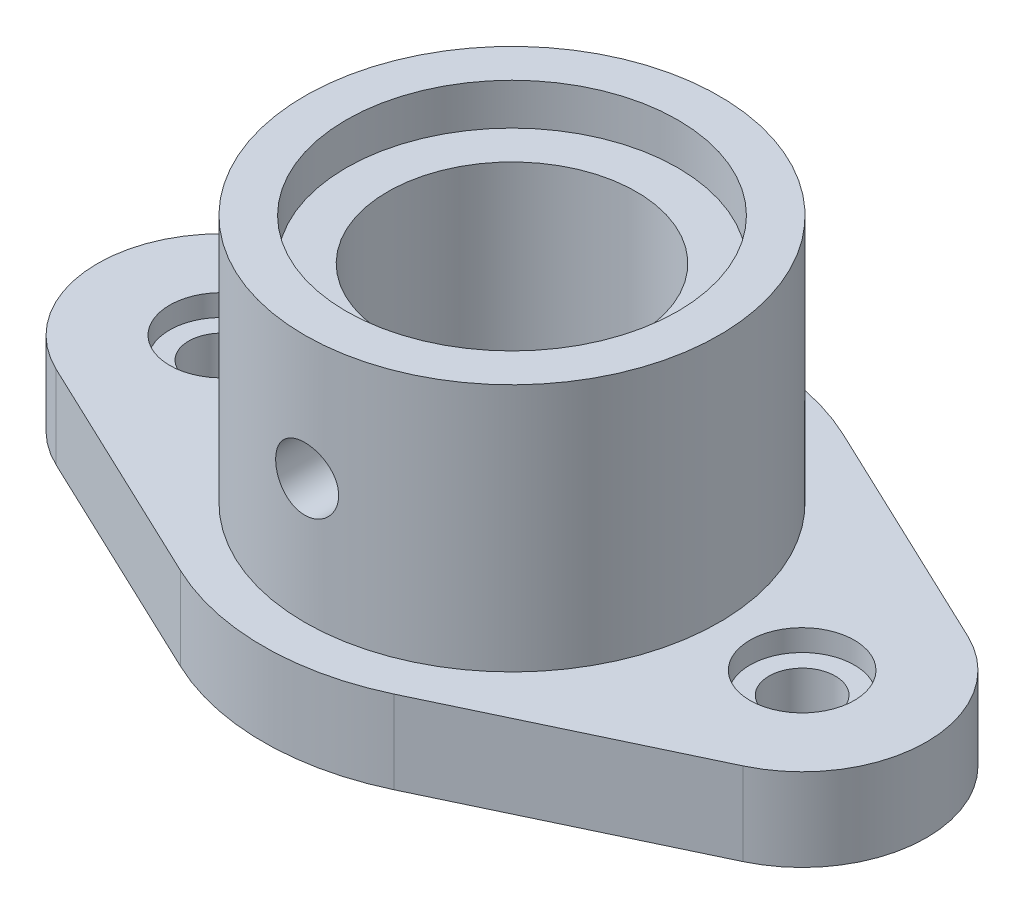
ISO-10303-21;
HEADER;
FILE_DESCRIPTION(('STEP AP214'),'2;1');
FILE_NAME('part.step','',(''),(''),'','','');
FILE_SCHEMA(('AUTOMOTIVE_DESIGN { 1 0 10303 214 1 1 1 1 }'));
ENDSEC;
DATA;
#1=APPLICATION_CONTEXT('core data for automotive mechanical design processes');
#2=APPLICATION_PROTOCOL_DEFINITION('international standard','automotive_design',2000,#1);
#3=PRODUCT_CONTEXT('',#1,'mechanical');
#4=PRODUCT('Part','Part','',(#3));
#5=PRODUCT_RELATED_PRODUCT_CATEGORY('part','',(#4));
#6=PRODUCT_DEFINITION_FORMATION('','',#4);
#7=PRODUCT_DEFINITION_CONTEXT('part definition',#1,'design');
#8=PRODUCT_DEFINITION('design','',#6,#7);
#9=PRODUCT_DEFINITION_SHAPE('','',#8);
#10=(LENGTH_UNIT() NAMED_UNIT(*) SI_UNIT(.MILLI.,.METRE.));
#11=(NAMED_UNIT(*) PLANE_ANGLE_UNIT() SI_UNIT($,.RADIAN.));
#12=(NAMED_UNIT(*) SI_UNIT($,.STERADIAN.) SOLID_ANGLE_UNIT());
#13=UNCERTAINTY_MEASURE_WITH_UNIT(LENGTH_MEASURE(1.E-05),#10,'distance_accuracy_value','');
#14=(GEOMETRIC_REPRESENTATION_CONTEXT(3) GLOBAL_UNCERTAINTY_ASSIGNED_CONTEXT((#13)) GLOBAL_UNIT_ASSIGNED_CONTEXT((#10,
#11,#12)) REPRESENTATION_CONTEXT('',''));
#15=CARTESIAN_POINT('',(0.,0.,0.));
#16=DIRECTION('',(0.,0.,1.));
#17=DIRECTION('',(1.,0.,0.));
#18=AXIS2_PLACEMENT_3D('',#15,#16,#17);
#19=CARTESIAN_POINT('',(-44.45,12.7,0.));
#20=DIRECTION('',(0.,-1.,0.));
#21=DIRECTION('',(0.,0.,-1.));
#22=AXIS2_PLACEMENT_3D('',#19,#20,#21);
#23=CYLINDRICAL_SURFACE('',#22,19.05);
#24=CARTESIAN_POINT('',(-44.45,0.,0.));
#25=DIRECTION('',(0.,1.,0.));
#26=DIRECTION('',(0.,0.,1.));
#27=AXIS2_PLACEMENT_3D('',#24,#25,#26);
#28=CIRCLE('',#27,19.05);
#29=CARTESIAN_POINT('',(-52.6142857142857,0.,-17.211825550345));
#30=VERTEX_POINT('',#29);
#31=CARTESIAN_POINT('',(-52.6142857142857,0.,17.211825550345));
#32=VERTEX_POINT('',#31);
#33=EDGE_CURVE('E139',#30,#32,#28,.T.);
#34=ORIENTED_EDGE('',*,*,#33,.T.);
#35=DIRECTION('',(0.,-1.,0.));
#36=VECTOR('',#35,1.);
#37=CARTESIAN_POINT('',(-52.6142857142857,12.7,17.211825550345));
#38=LINE('',#37,#36);
#39=CARTESIAN_POINT('',(-52.6142857142857,12.7,17.211825550345));
#40=VERTEX_POINT('',#39);
#41=EDGE_CURVE('E49',#40,#32,#38,.T.);
#42=ORIENTED_EDGE('',*,*,#41,.F.);
#43=CARTESIAN_POINT('',(-44.45,12.7,0.));
#44=DIRECTION('',(0.,1.,0.));
#45=DIRECTION('',(0.,0.,1.));
#46=AXIS2_PLACEMENT_3D('',#43,#44,#45);
#47=CIRCLE('',#46,19.05);
#48=CARTESIAN_POINT('',(-52.6142857142857,12.7,-17.211825550345));
#49=VERTEX_POINT('',#48);
#50=EDGE_CURVE('E154',#49,#40,#47,.T.);
#51=ORIENTED_EDGE('',*,*,#50,.F.);
#52=DIRECTION('',(0.,-1.,0.));
#53=VECTOR('',#52,1.);
#54=CARTESIAN_POINT('',(-52.6142857142857,12.7,-17.211825550345));
#55=LINE('',#54,#53);
#56=EDGE_CURVE('E135',#49,#30,#55,.T.);
#57=ORIENTED_EDGE('',*,*,#56,.T.);
#58=EDGE_LOOP('',(#34,#42,#51,#57));
#59=FACE_BOUND('',#58,.T.);
#60=ADVANCED_FACE('F35',(#59),#23,.T.);
#61=CARTESIAN_POINT('',(-16.3285714285714,12.7,34.4236511006901));
#62=DIRECTION('',(0.428571428571429,0.,-0.903507902905251));
#63=DIRECTION('',(-0.903507902905251,0.,-0.428571428571429));
#64=AXIS2_PLACEMENT_3D('',#61,#62,#63);
#65=PLANE('',#64);
#66=DIRECTION('',(0.903507902905251,0.,0.428571428571429));
#67=VECTOR('',#66,1.);
#68=CARTESIAN_POINT('',(-16.3285714285714,0.,34.4236511006901));
#69=LINE('',#68,#67);
#70=CARTESIAN_POINT('',(-16.3285714285715,0.,34.4236511006901));
#71=VERTEX_POINT('',#70);
#72=EDGE_CURVE('E142',#32,#71,#69,.T.);
#73=ORIENTED_EDGE('',*,*,#72,.T.);
#74=DIRECTION('',(0.,-1.,0.));
#75=VECTOR('',#74,1.);
#76=CARTESIAN_POINT('',(-16.3285714285715,12.7,34.4236511006901));
#77=LINE('',#76,#75);
#78=CARTESIAN_POINT('',(-16.3285714285715,12.7,34.4236511006901));
#79=VERTEX_POINT('',#78);
#80=EDGE_CURVE('E164',#79,#71,#77,.T.);
#81=ORIENTED_EDGE('',*,*,#80,.F.);
#82=DIRECTION('',(0.903507902905251,0.,0.428571428571429));
#83=VECTOR('',#82,1.);
#84=CARTESIAN_POINT('',(-16.3285714285714,12.7,34.4236511006901));
#85=LINE('',#84,#83);
#86=EDGE_CURVE('E102',#40,#79,#85,.T.);
#87=ORIENTED_EDGE('',*,*,#86,.F.);
#88=ORIENTED_EDGE('',*,*,#41,.T.);
#89=EDGE_LOOP('',(#73,#81,#87,#88));
#90=FACE_BOUND('',#89,.T.);
#91=ADVANCED_FACE('F167',(#90),#65,.F.);
#92=CARTESIAN_POINT('',(0.,12.7,0.));
#93=DIRECTION('',(0.,-1.,0.));
#94=DIRECTION('',(0.,0.,-1.));
#95=AXIS2_PLACEMENT_3D('',#92,#93,#94);
#96=CYLINDRICAL_SURFACE('',#95,38.1);
#97=CARTESIAN_POINT('',(0.,0.,0.));
#98=DIRECTION('',(0.,1.,0.));
#99=DIRECTION('',(0.,0.,1.));
#100=AXIS2_PLACEMENT_3D('',#97,#98,#99);
#101=CIRCLE('',#100,38.1);
#102=CARTESIAN_POINT('',(16.3285714285714,0.,34.4236511006901));
#103=VERTEX_POINT('',#102);
#104=EDGE_CURVE('E145',#71,#103,#101,.T.);
#105=ORIENTED_EDGE('',*,*,#104,.T.);
#106=DIRECTION('',(0.,-1.,0.));
#107=VECTOR('',#106,1.);
#108=CARTESIAN_POINT('',(16.3285714285714,12.7,34.4236511006901));
#109=LINE('',#108,#107);
#110=CARTESIAN_POINT('',(16.3285714285714,12.7,34.4236511006901));
#111=VERTEX_POINT('',#110);
#112=EDGE_CURVE('E161',#111,#103,#109,.T.);
#113=ORIENTED_EDGE('',*,*,#112,.F.);
#114=CARTESIAN_POINT('',(0.,12.7,0.));
#115=DIRECTION('',(0.,1.,0.));
#116=DIRECTION('',(0.,0.,1.));
#117=AXIS2_PLACEMENT_3D('',#114,#115,#116);
#118=CIRCLE('',#117,38.1);
#119=EDGE_CURVE('E185',#79,#111,#118,.T.);
#120=ORIENTED_EDGE('',*,*,#119,.F.);
#121=ORIENTED_EDGE('',*,*,#80,.T.);
#122=EDGE_LOOP('',(#105,#113,#120,#121));
#123=FACE_BOUND('',#122,.T.);
#124=ADVANCED_FACE('F178',(#123),#96,.T.);
#125=CARTESIAN_POINT('',(16.3285714285714,12.7,34.4236511006901));
#126=DIRECTION('',(-0.428571428571429,0.,-0.903507902905251));
#127=DIRECTION('',(-0.903507902905251,0.,0.428571428571429));
#128=AXIS2_PLACEMENT_3D('',#125,#126,#127);
#129=PLANE('',#128);
#130=DIRECTION('',(0.903507902905251,0.,-0.428571428571429));
#131=VECTOR('',#130,1.);
#132=CARTESIAN_POINT('',(16.3285714285714,0.,34.4236511006901));
#133=LINE('',#132,#131);
#134=CARTESIAN_POINT('',(52.6142857142857,0.,17.211825550345));
#135=VERTEX_POINT('',#134);
#136=EDGE_CURVE('E147',#103,#135,#133,.T.);
#137=ORIENTED_EDGE('',*,*,#136,.T.);
#138=DIRECTION('',(0.,-1.,0.));
#139=VECTOR('',#138,1.);
#140=CARTESIAN_POINT('',(52.6142857142857,12.7,17.211825550345));
#141=LINE('',#140,#139);
#142=CARTESIAN_POINT('',(52.6142857142857,12.7,17.211825550345));
#143=VERTEX_POINT('',#142);
#144=EDGE_CURVE('E158',#143,#135,#141,.T.);
#145=ORIENTED_EDGE('',*,*,#144,.F.);
#146=DIRECTION('',(0.903507902905251,0.,-0.428571428571429));
#147=VECTOR('',#146,1.);
#148=CARTESIAN_POINT('',(16.3285714285714,12.7,34.4236511006901));
#149=LINE('',#148,#147);
#150=EDGE_CURVE('E184',#111,#143,#149,.T.);
#151=ORIENTED_EDGE('',*,*,#150,.F.);
#152=ORIENTED_EDGE('',*,*,#112,.T.);
#153=EDGE_LOOP('',(#137,#145,#151,#152));
#154=FACE_BOUND('',#153,.T.);
#155=ADVANCED_FACE('F182',(#154),#129,.F.);
#156=CARTESIAN_POINT('',(44.45,12.7,0.));
#157=DIRECTION('',(0.,-1.,0.));
#158=DIRECTION('',(0.,0.,-1.));
#159=AXIS2_PLACEMENT_3D('',#156,#157,#158);
#160=CYLINDRICAL_SURFACE('',#159,19.05);
#161=CARTESIAN_POINT('',(44.45,0.,0.));
#162=DIRECTION('',(0.,1.,0.));
#163=DIRECTION('',(0.,0.,1.));
#164=AXIS2_PLACEMENT_3D('',#161,#162,#163);
#165=CIRCLE('',#164,19.05);
#166=CARTESIAN_POINT('',(52.6142857142857,0.,-17.211825550345));
#167=VERTEX_POINT('',#166);
#168=EDGE_CURVE('E149',#135,#167,#165,.T.);
#169=ORIENTED_EDGE('',*,*,#168,.T.);
#170=DIRECTION('',(0.,-1.,0.));
#171=VECTOR('',#170,1.);
#172=CARTESIAN_POINT('',(52.6142857142857,12.7,-17.211825550345));
#173=LINE('',#172,#171);
#174=CARTESIAN_POINT('',(52.6142857142857,12.7,-17.211825550345));
#175=VERTEX_POINT('',#174);
#176=EDGE_CURVE('E130',#175,#167,#173,.T.);
#177=ORIENTED_EDGE('',*,*,#176,.F.);
#178=CARTESIAN_POINT('',(44.45,12.7,0.));
#179=DIRECTION('',(0.,1.,0.));
#180=DIRECTION('',(0.,0.,1.));
#181=AXIS2_PLACEMENT_3D('',#178,#179,#180);
#182=CIRCLE('',#181,19.05);
#183=EDGE_CURVE('E121',#143,#175,#182,.T.);
#184=ORIENTED_EDGE('',*,*,#183,.F.);
#185=ORIENTED_EDGE('',*,*,#144,.T.);
#186=EDGE_LOOP('',(#169,#177,#184,#185));
#187=FACE_BOUND('',#186,.T.);
#188=ADVANCED_FACE('F293',(#187),#160,.T.);
#189=CARTESIAN_POINT('',(52.6142857142857,12.7,-17.211825550345));
#190=DIRECTION('',(-0.428571428571428,0.,0.903507902905251));
#191=DIRECTION('',(0.903507902905251,0.,0.428571428571429));
#192=AXIS2_PLACEMENT_3D('',#189,#190,#191);
#193=PLANE('',#192);
#194=DIRECTION('',(-0.903507902905251,0.,-0.428571428571428));
#195=VECTOR('',#194,1.);
#196=CARTESIAN_POINT('',(52.6142857142857,0.,-17.211825550345));
#197=LINE('',#196,#195);
#198=CARTESIAN_POINT('',(16.3285714285714,0.,-34.4236511006901));
#199=VERTEX_POINT('',#198);
#200=EDGE_CURVE('E129',#167,#199,#197,.T.);
#201=ORIENTED_EDGE('',*,*,#200,.T.);
#202=DIRECTION('',(0.,-1.,0.));
#203=VECTOR('',#202,1.);
#204=CARTESIAN_POINT('',(16.3285714285714,12.7,-34.4236511006901));
#205=LINE('',#204,#203);
#206=CARTESIAN_POINT('',(16.3285714285714,12.7,-34.4236511006901));
#207=VERTEX_POINT('',#206);
#208=EDGE_CURVE('E126',#207,#199,#205,.T.);
#209=ORIENTED_EDGE('',*,*,#208,.F.);
#210=DIRECTION('',(-0.903507902905251,0.,-0.428571428571428));
#211=VECTOR('',#210,1.);
#212=CARTESIAN_POINT('',(52.6142857142857,12.7,-17.211825550345));
#213=LINE('',#212,#211);
#214=EDGE_CURVE('E115',#175,#207,#213,.T.);
#215=ORIENTED_EDGE('',*,*,#214,.F.);
#216=ORIENTED_EDGE('',*,*,#176,.T.);
#217=EDGE_LOOP('',(#201,#209,#215,#216));
#218=FACE_BOUND('',#217,.T.);
#219=ADVANCED_FACE('F127',(#218),#193,.F.);
#220=CARTESIAN_POINT('',(0.,12.7,0.));
#221=DIRECTION('',(0.,-1.,0.));
#222=DIRECTION('',(0.,0.,-1.));
#223=AXIS2_PLACEMENT_3D('',#220,#221,#222);
#224=CYLINDRICAL_SURFACE('',#223,38.1);
#225=CARTESIAN_POINT('',(0.,0.,0.));
#226=DIRECTION('',(0.,1.,0.));
#227=DIRECTION('',(0.,0.,1.));
#228=AXIS2_PLACEMENT_3D('',#225,#226,#227);
#229=CIRCLE('',#228,38.1);
#230=CARTESIAN_POINT('',(-16.3285714285714,0.,-34.4236511006901));
#231=VERTEX_POINT('',#230);
#232=EDGE_CURVE('E87',#199,#231,#229,.T.);
#233=ORIENTED_EDGE('',*,*,#232,.T.);
#234=DIRECTION('',(0.,-1.,0.));
#235=VECTOR('',#234,1.);
#236=CARTESIAN_POINT('',(-16.3285714285714,12.7,-34.4236511006901));
#237=LINE('',#236,#235);
#238=CARTESIAN_POINT('',(-16.3285714285714,12.7,-34.4236511006901));
#239=VERTEX_POINT('',#238);
#240=EDGE_CURVE('E131',#239,#231,#237,.T.);
#241=ORIENTED_EDGE('',*,*,#240,.F.);
#242=CARTESIAN_POINT('',(0.,12.7,0.));
#243=DIRECTION('',(0.,1.,0.));
#244=DIRECTION('',(0.,0.,1.));
#245=AXIS2_PLACEMENT_3D('',#242,#243,#244);
#246=CIRCLE('',#245,38.1);
#247=EDGE_CURVE('E119',#207,#239,#246,.T.);
#248=ORIENTED_EDGE('',*,*,#247,.F.);
#249=ORIENTED_EDGE('',*,*,#208,.T.);
#250=EDGE_LOOP('',(#233,#241,#248,#249));
#251=FACE_BOUND('',#250,.T.);
#252=ADVANCED_FACE('F133',(#251),#224,.T.);
#253=CARTESIAN_POINT('',(-52.6142857142857,12.7,-17.211825550345));
#254=DIRECTION('',(0.428571428571429,0.,0.903507902905251));
#255=DIRECTION('',(0.903507902905251,0.,-0.428571428571429));
#256=AXIS2_PLACEMENT_3D('',#253,#254,#255);
#257=PLANE('',#256);
#258=DIRECTION('',(-0.903507902905251,0.,0.428571428571429));
#259=VECTOR('',#258,1.);
#260=CARTESIAN_POINT('',(-52.6142857142857,0.,-17.211825550345));
#261=LINE('',#260,#259);
#262=EDGE_CURVE('E93',#231,#30,#261,.T.);
#263=ORIENTED_EDGE('',*,*,#262,.T.);
#264=ORIENTED_EDGE('',*,*,#56,.F.);
#265=DIRECTION('',(-0.903507902905251,0.,0.428571428571429));
#266=VECTOR('',#265,1.);
#267=CARTESIAN_POINT('',(-52.6142857142857,12.7,-17.211825550345));
#268=LINE('',#267,#266);
#269=EDGE_CURVE('E58',#239,#49,#268,.T.);
#270=ORIENTED_EDGE('',*,*,#269,.F.);
#271=ORIENTED_EDGE('',*,*,#240,.T.);
#272=EDGE_LOOP('',(#263,#264,#270,#271));
#273=FACE_BOUND('',#272,.T.);
#274=ADVANCED_FACE('F301',(#273),#257,.F.);
#275=CARTESIAN_POINT('',(-44.45,12.7,0.));
#276=DIRECTION('',(0.,1.,0.));
#277=DIRECTION('',(0.,0.,1.));
#278=AXIS2_PLACEMENT_3D('',#275,#276,#277);
#279=PLANE('',#278);
#280=CARTESIAN_POINT('',(-44.45,12.7,0.));
#281=DIRECTION('',(0.,1.,0.));
#282=DIRECTION('',(0.,0.,1.));
#283=AXIS2_PLACEMENT_3D('',#280,#281,#282);
#284=CIRCLE('',#283,8.001);
#285=CARTESIAN_POINT('',(-44.45,12.7,8.001));
#286=VERTEX_POINT('',#285);
#287=EDGE_CURVE('E226',#286,#286,#284,.T.);
#288=ORIENTED_EDGE('',*,*,#287,.F.);
#289=EDGE_LOOP('',(#288));
#290=FACE_BOUND('',#289,.T.);
#291=CARTESIAN_POINT('',(44.45,12.7,0.));
#292=DIRECTION('',(0.,1.,0.));
#293=DIRECTION('',(0.,0.,1.));
#294=AXIS2_PLACEMENT_3D('',#291,#292,#293);
#295=CIRCLE('',#294,8.001);
#296=CARTESIAN_POINT('',(44.45,12.7,8.001));
#297=VERTEX_POINT('',#296);
#298=EDGE_CURVE('E214',#297,#297,#295,.T.);
#299=ORIENTED_EDGE('',*,*,#298,.F.);
#300=EDGE_LOOP('',(#299));
#301=FACE_BOUND('',#300,.T.);
#302=CARTESIAN_POINT('',(0.,12.7,0.));
#303=DIRECTION('',(0.,1.,0.));
#304=DIRECTION('',(0.,0.,1.));
#305=AXIS2_PLACEMENT_3D('',#302,#303,#304);
#306=CIRCLE('',#305,31.75);
#307=CARTESIAN_POINT('',(0.,12.7,31.75));
#308=VERTEX_POINT('',#307);
#309=EDGE_CURVE('E11',#308,#308,#306,.T.);
#310=ORIENTED_EDGE('',*,*,#309,.F.);
#311=EDGE_LOOP('',(#310));
#312=FACE_BOUND('',#311,.T.);
#313=ORIENTED_EDGE('',*,*,#50,.T.);
#314=ORIENTED_EDGE('',*,*,#86,.T.);
#315=ORIENTED_EDGE('',*,*,#119,.T.);
#316=ORIENTED_EDGE('',*,*,#150,.T.);
#317=ORIENTED_EDGE('',*,*,#183,.T.);
#318=ORIENTED_EDGE('',*,*,#214,.T.);
#319=ORIENTED_EDGE('',*,*,#247,.T.);
#320=ORIENTED_EDGE('',*,*,#269,.T.);
#321=EDGE_LOOP('',(#313,#314,#315,#316,#317,#318,#319,#320));
#322=FACE_BOUND('',#321,.T.);
#323=ADVANCED_FACE('F117',(#290,#301,#312,#322),#279,.T.);
#324=CARTESIAN_POINT('',(-44.45,0.,0.));
#325=DIRECTION('',(0.,1.,0.));
#326=DIRECTION('',(0.,0.,1.));
#327=AXIS2_PLACEMENT_3D('',#324,#325,#326);
#328=PLANE('',#327);
#329=CARTESIAN_POINT('',(-44.45,0.,0.));
#330=DIRECTION('',(0.,1.,0.));
#331=DIRECTION('',(0.,0.,1.));
#332=AXIS2_PLACEMENT_3D('',#329,#330,#331);
#333=CIRCLE('',#332,5.07999999999999);
#334=CARTESIAN_POINT('',(-44.45,0.,5.07999999999999));
#335=VERTEX_POINT('',#334);
#336=EDGE_CURVE('E217',#335,#335,#333,.T.);
#337=ORIENTED_EDGE('',*,*,#336,.T.);
#338=EDGE_LOOP('',(#337));
#339=FACE_BOUND('',#338,.T.);
#340=CARTESIAN_POINT('',(44.45,0.,0.));
#341=DIRECTION('',(0.,1.,0.));
#342=DIRECTION('',(0.,0.,1.));
#343=AXIS2_PLACEMENT_3D('',#340,#341,#342);
#344=CIRCLE('',#343,5.07999999999999);
#345=CARTESIAN_POINT('',(44.45,0.,5.07999999999999));
#346=VERTEX_POINT('',#345);
#347=EDGE_CURVE('E205',#346,#346,#344,.T.);
#348=ORIENTED_EDGE('',*,*,#347,.T.);
#349=EDGE_LOOP('',(#348));
#350=FACE_BOUND('',#349,.T.);
#351=CARTESIAN_POINT('',(0.,0.,0.));
#352=DIRECTION('',(0.,1.,0.));
#353=DIRECTION('',(0.,0.,1.));
#354=AXIS2_PLACEMENT_3D('',#351,#352,#353);
#355=CIRCLE('',#354,19.05);
#356=CARTESIAN_POINT('',(0.,0.,19.05));
#357=VERTEX_POINT('',#356);
#358=EDGE_CURVE('E193',#357,#357,#355,.T.);
#359=ORIENTED_EDGE('',*,*,#358,.T.);
#360=EDGE_LOOP('',(#359));
#361=FACE_BOUND('',#360,.T.);
#362=ORIENTED_EDGE('',*,*,#33,.F.);
#363=ORIENTED_EDGE('',*,*,#262,.F.);
#364=ORIENTED_EDGE('',*,*,#232,.F.);
#365=ORIENTED_EDGE('',*,*,#200,.F.);
#366=ORIENTED_EDGE('',*,*,#168,.F.);
#367=ORIENTED_EDGE('',*,*,#136,.F.);
#368=ORIENTED_EDGE('',*,*,#104,.F.);
#369=ORIENTED_EDGE('',*,*,#72,.F.);
#370=EDGE_LOOP('',(#362,#363,#364,#365,#366,#367,#368,#369));
#371=FACE_BOUND('',#370,.T.);
#372=ADVANCED_FACE('F172',(#339,#350,#361,#371),#328,.F.);
#373=CARTESIAN_POINT('',(0.,50.8,0.));
#374=DIRECTION('',(0.,-1.,0.));
#375=DIRECTION('',(0.,0.,-1.));
#376=AXIS2_PLACEMENT_3D('',#373,#374,#375);
#377=CYLINDRICAL_SURFACE('',#376,31.75);
#378=CARTESIAN_POINT('',(-4.826,31.75,31.3810806697284));
#379=CARTESIAN_POINT('',(-4.8260018661553,31.8847419436261,31.3810798905383));
#380=CARTESIAN_POINT('',(-4.8203551463665,32.019457866581,31.3819502019671));
#381=CARTESIAN_POINT('',(-4.79781348406068,32.2879677918923,31.3854046268156));
#382=CARTESIAN_POINT('',(-4.78091597357927,32.4217615767274,31.387989131495));
#383=CARTESIAN_POINT('',(-4.73598200103108,32.6875106044496,31.3948003329495));
#384=CARTESIAN_POINT('',(-4.70793811610386,32.8194645613793,31.3990281240196));
#385=CARTESIAN_POINT('',(-4.64091192990172,33.0805576924962,31.4090048241569));
#386=CARTESIAN_POINT('',(-4.60192561507136,33.2096958151031,31.4147542913128));
#387=CARTESIAN_POINT('',(-4.513360720291,33.4640494562103,31.427600494546));
#388=CARTESIAN_POINT('',(-4.46379440944599,33.5892693272869,31.4346956690191));
#389=CARTESIAN_POINT('',(-4.35438521589033,33.835117516261,31.4500378367867));
#390=CARTESIAN_POINT('',(-4.29453854641961,33.9557441221603,31.4582852542991));
#391=CARTESIAN_POINT('',(-4.16504449722869,34.1914656570763,31.4756916956856));
#392=CARTESIAN_POINT('',(-4.09540217610511,34.3065634003684,31.4848502483282));
#393=CARTESIAN_POINT('',(-3.94675691463239,34.5305501605325,31.5038287119398));
#394=CARTESIAN_POINT('',(-3.86775049935088,34.6394368501946,31.5136488678369));
#395=CARTESIAN_POINT('',(-3.70036284240657,34.8509525632057,31.5337433125968));
#396=CARTESIAN_POINT('',(-3.61191997537499,34.9535325670202,31.5440202943338));
#397=CARTESIAN_POINT('',(-3.42670024379995,35.1509302735951,31.5646781981156));
#398=CARTESIAN_POINT('',(-3.32992030694016,35.2457450894597,31.5750591572212));
#399=CARTESIAN_POINT('',(-3.12875307227639,35.4268863790535,31.5956265936238));
#400=CARTESIAN_POINT('',(-3.02436815399328,35.5132154881816,31.6058131305053));
#401=CARTESIAN_POINT('',(-2.80864658539232,35.6768458285498,31.6257133341791));
#402=CARTESIAN_POINT('',(-2.69730738591693,35.754143719153,31.6354268252223));
#403=CARTESIAN_POINT('',(-2.46794227034277,35.8994628617084,31.6541473248498));
#404=CARTESIAN_POINT('',(-2.34988805089781,35.9674399811198,31.6631508920699));
#405=CARTESIAN_POINT('',(-2.10839273647507,36.0932163281804,31.6801497202248));
#406=CARTESIAN_POINT('',(-1.98494965380316,36.1510117600285,31.6881446048022));
#407=CARTESIAN_POINT('',(-1.60792337782613,36.3083798694195,31.7102524001697));
#408=CARTESIAN_POINT('',(-1.3473779260103,36.3921021599604,31.7225108924722));
#409=CARTESIAN_POINT('',(-0.817873809305293,36.5138954819344,31.7405625255981));
#410=CARTESIAN_POINT('',(-0.54899541168763,36.5523131990801,31.7464047419101));
#411=CARTESIAN_POINT('',(-0.00851189189896186,36.5835723135611,31.7511478535652));
#412=CARTESIAN_POINT('',(0.263093073935696,36.5764163092739,31.7500491446441));
#413=CARTESIAN_POINT('',(0.798912981074846,36.5169799455177,31.7410695034661));
#414=CARTESIAN_POINT('',(1.06317038338057,36.4650720289971,31.7332445512281));
#415=CARTESIAN_POINT('',(1.57918261418568,36.3181965029528,31.7117550204234));
#416=CARTESIAN_POINT('',(1.83093711371027,36.2232277610834,31.698090288292));
#417=CARTESIAN_POINT('',(2.31591889381348,35.9925447448171,31.6663602076528));
#418=CARTESIAN_POINT('',(2.54907063698646,35.8566740774798,31.6482780194532));
#419=CARTESIAN_POINT('',(2.9894058499768,35.548158761024,31.6097276259839));
#420=CARTESIAN_POINT('',(3.19658756375225,35.3755116272822,31.5892592595458));
#421=CARTESIAN_POINT('',(3.58129712877752,34.9962705541476,31.5479744814369));
#422=CARTESIAN_POINT('',(3.75850442208646,34.7893514363737,31.5271566423314));
#423=CARTESIAN_POINT('',(4.07573075211893,34.3485438477946,31.48772064305));
#424=CARTESIAN_POINT('',(4.21574954802041,34.1146552023566,31.469102497119));
#425=CARTESIAN_POINT('',(4.45466981730756,33.6262093400217,31.436174134966));
#426=CARTESIAN_POINT('',(4.55353769317424,33.3716354365884,31.4218674414329));
#427=CARTESIAN_POINT('',(4.70702368720634,32.8492296688503,31.3992436841821));
#428=CARTESIAN_POINT('',(4.76164501202292,32.5813987668044,31.3909261864183));
#429=CARTESIAN_POINT('',(4.82464642118158,32.0429356307147,31.3813050655429));
#430=CARTESIAN_POINT('',(4.83348120947046,31.7723577878793,31.3799324761251));
#431=CARTESIAN_POINT('',(4.80586588603897,31.2335859678068,31.3841734104998));
#432=CARTESIAN_POINT('',(4.76941721854759,30.9653919148181,31.3897867114908));
#433=CARTESIAN_POINT('',(4.65265553087364,30.4404135032763,31.4073035529928));
#434=CARTESIAN_POINT('',(4.57256961050916,30.1835774526937,31.4191745166455));
#435=CARTESIAN_POINT('',(4.37104315229028,29.6869742765597,31.4478421998681));
#436=CARTESIAN_POINT('',(4.24960052180733,29.4472080154733,31.4646391686852));
#437=CARTESIAN_POINT('',(3.96771794761046,28.9895138500629,31.5014284964492));
#438=CARTESIAN_POINT('',(3.80698400122447,28.7717689522135,31.5214445370665));
#439=CARTESIAN_POINT('',(3.45148858492913,28.3661810859602,31.5623455816839));
#440=CARTESIAN_POINT('',(3.25672513755304,28.1783398564824,31.583230636129));
#441=CARTESIAN_POINT('',(2.83669909054815,27.8362549790903,31.6237324538315));
#442=CARTESIAN_POINT('',(2.6111895429746,27.6823128884466,31.6433368214408));
#443=CARTESIAN_POINT('',(2.13723599519737,27.4144996859518,31.6788745655386));
#444=CARTESIAN_POINT('',(1.88879263631248,27.3006274540196,31.6948080446359));
#445=CARTESIAN_POINT('',(1.37701134262048,27.1166620968469,31.7211562329294));
#446=CARTESIAN_POINT('',(1.113733335518,27.0464049182874,31.731591599983));
#447=CARTESIAN_POINT('',(0.578796032676614,26.9511507459408,31.7458480488539));
#448=CARTESIAN_POINT('',(0.307137307275309,26.9261506791267,31.7496695797601));
#449=CARTESIAN_POINT('',(-0.0989586937131517,26.9231306202465,31.7501338887952));
#450=CARTESIAN_POINT('',(-0.233481410961587,26.9277721825772,31.7494256939288));
#451=CARTESIAN_POINT('',(-0.501637341101348,26.9482627070642,31.7463190490647));
#452=CARTESIAN_POINT('',(-0.635270868095055,26.9641074735324,31.743921231845));
#453=CARTESIAN_POINT('',(-0.90074796037911,27.0068972925301,31.7374984606737));
#454=CARTESIAN_POINT('',(-1.03259086663335,27.0338463234163,31.7334729235639));
#455=CARTESIAN_POINT('',(-1.29347036573143,27.0986276879381,31.7239099341355));
#456=CARTESIAN_POINT('',(-1.42250795527857,27.1364560859479,31.7183730285932));
#457=CARTESIAN_POINT('',(-1.67686484022541,27.2227019245705,31.7059431937717));
#458=CARTESIAN_POINT('',(-1.80218568047765,27.2711148936609,31.6990508372349));
#459=CARTESIAN_POINT('',(-2.0482542287486,27.3781666887283,31.6841023858937));
#460=CARTESIAN_POINT('',(-2.1690035650673,27.4368018312104,31.6760467104627));
#461=CARTESIAN_POINT('',(-2.40519435115754,27.5639148210006,31.6589887237599));
#462=CARTESIAN_POINT('',(-2.52063375486159,27.63239642118,31.6499860519035));
#463=CARTESIAN_POINT('',(-2.74533055520362,27.7786775755021,31.6312877965702));
#464=CARTESIAN_POINT('',(-2.85459012554852,27.8564738229022,31.6215924594827));
#465=CARTESIAN_POINT('',(-3.06728975384043,28.0216862106902,31.6016733519182));
#466=CARTESIAN_POINT('',(-3.17066092541805,28.1091905337723,31.5914452764622));
#467=CARTESIAN_POINT('',(-3.36964235433473,28.2925324209846,31.570841200589));
#468=CARTESIAN_POINT('',(-3.46525538625208,28.3883669803111,31.5604652546301));
#469=CARTESIAN_POINT('',(-3.64815773324166,28.5877953609352,31.5398465813721));
#470=CARTESIAN_POINT('',(-3.73544201124098,28.6913938109187,31.529603937885));
#471=CARTESIAN_POINT('',(-3.90098294999229,28.9055461509471,31.5095506710706));
#472=CARTESIAN_POINT('',(-3.97924293050774,29.0160974599697,31.499739889701));
#473=CARTESIAN_POINT('',(-4.1266747437838,29.2441312333703,31.4807658156349));
#474=CARTESIAN_POINT('',(-4.1957875270181,29.3616522524075,31.4716068911528));
#475=CARTESIAN_POINT('',(-4.32382758064726,29.6021309958218,31.454271397658));
#476=CARTESIAN_POINT('',(-4.38275858349775,29.7250867070932,31.4460944690002));
#477=CARTESIAN_POINT('',(-4.48999222139879,29.9755189768526,31.430962500533));
#478=CARTESIAN_POINT('',(-4.5383026137067,30.1029921562429,31.4240065696646));
#479=CARTESIAN_POINT('',(-4.62397517856044,30.3615886544482,31.411514162333));
#480=CARTESIAN_POINT('',(-4.66133979384286,30.4927111516925,31.4059773691996));
#481=CARTESIAN_POINT('',(-4.73716713551813,30.8091196129352,31.3946455901809));
#482=CARTESIAN_POINT('',(-4.77044191611085,30.9957000603525,31.3895823633182));
#483=CARTESIAN_POINT('',(-4.81485688864162,31.3715374651383,31.38280047275));
#484=CARTESIAN_POINT('',(-4.8259973795312,31.5607943863229,31.3810817638727));
#485=CARTESIAN_POINT('',(-4.826,31.75,31.3810806697284));
#486=B_SPLINE_CURVE_WITH_KNOTS('',3,(#378,#379,#380,#381,#382,#383,#384,#385,#386,#387,#388,
#389,#390,#391,#392,#393,#394,#395,#396,#397,#398,#399,#400,#401,#402,#403,#404,#405,#406,#407,
#408,#409,#410,#411,#412,#413,#414,#415,#416,#417,#418,#419,#420,#421,#422,#423,#424,#425,#426,
#427,#428,#429,#430,#431,#432,#433,#434,#435,#436,#437,#438,#439,#440,#441,#442,#443,#444,#445,
#446,#447,#448,#449,#450,#451,#452,#453,#454,#455,#456,#457,#458,#459,#460,#461,#462,#463,#464,
#465,#466,#467,#468,#469,#470,#471,#472,#473,#474,#475,#476,#477,#478,#479,#480,#481,#482,#483,
#484,#485),.UNSPECIFIED.,.T.,.F.,(4,2,2,2,2,2,2,2,2,2,2,2,2,2,2,2,2,2,2,2,2,2,2,2,2,2,2,2,2,2,2,
2,2,2,2,2,2,2,2,2,2,2,2,2,2,2,2,2,2,2,2,2,2,4),(0.,0.40406003725429,0.808212331815288,
1.21263422130655,1.61720464230762,2.02130842717708,2.42556138372486,2.82960634027324,
3.23380170655828,3.64082022829568,4.04798938848481,4.45503169226673,4.86222408699239,
5.27128240588447,5.68049290321276,6.49798198538133,7.30917391548025,8.12031959602982,
8.92477906262968,9.72925968486361,10.5368562623486,11.3445074184891,12.1603139257128,
12.9761257157365,13.7926022719503,14.6090196509009,15.4173134734916,16.2255815177627,
17.0296827485733,17.833824672545,18.6441784973957,19.4545794278744,20.2719217526441,
21.0892412282551,21.9034675160734,22.7176385146096,23.1210594529126,23.5243293868717,
23.927743927307,24.3310127151484,24.7341114674704,25.137065264837,25.5401730528313,
25.9431381576639,26.350121093185,26.7569578300934,27.1640390750879,27.570970086329,
27.9804117155229,28.3897029309217,28.7986942008234,29.2075941277025,29.7749858235183,
30.3423698559412),.UNSPECIFIED.);
#487=CARTESIAN_POINT('',(-4.826,31.75,31.3810806697284));
#488=VERTEX_POINT('',#487);
#489=EDGE_CURVE('E38',#488,#488,#486,.T.);
#490=ORIENTED_EDGE('',*,*,#489,.T.);
#491=EDGE_LOOP('',(#490));
#492=FACE_BOUND('',#491,.T.);
#493=CARTESIAN_POINT('',(0.,50.8,0.));
#494=DIRECTION('',(0.,1.,0.));
#495=DIRECTION('',(0.,0.,1.));
#496=AXIS2_PLACEMENT_3D('',#493,#494,#495);
#497=CIRCLE('',#496,31.75);
#498=CARTESIAN_POINT('',(0.,50.8,31.75));
#499=VERTEX_POINT('',#498);
#500=EDGE_CURVE('E143',#499,#499,#497,.T.);
#501=ORIENTED_EDGE('',*,*,#500,.F.);
#502=EDGE_LOOP('',(#501));
#503=FACE_BOUND('',#502,.T.);
#504=ORIENTED_EDGE('',*,*,#309,.T.);
#505=EDGE_LOOP('',(#504));
#506=FACE_BOUND('',#505,.T.);
#507=ADVANCED_FACE('F306',(#492,#503,#506),#377,.T.);
#508=CARTESIAN_POINT('',(0.,50.8,0.));
#509=DIRECTION('',(0.,1.,0.));
#510=DIRECTION('',(0.,0.,1.));
#511=AXIS2_PLACEMENT_3D('',#508,#509,#510);
#512=PLANE('',#511);
#513=CARTESIAN_POINT('',(0.,50.8,0.));
#514=DIRECTION('',(0.,1.,0.));
#515=DIRECTION('',(0.,0.,1.));
#516=AXIS2_PLACEMENT_3D('',#513,#514,#515);
#517=CIRCLE('',#516,25.4);
#518=CARTESIAN_POINT('',(0.,50.8,25.4));
#519=VERTEX_POINT('',#518);
#520=EDGE_CURVE('E202',#519,#519,#517,.T.);
#521=ORIENTED_EDGE('',*,*,#520,.F.);
#522=EDGE_LOOP('',(#521));
#523=FACE_BOUND('',#522,.T.);
#524=ORIENTED_EDGE('',*,*,#500,.T.);
#525=EDGE_LOOP('',(#524));
#526=FACE_BOUND('',#525,.T.);
#527=ADVANCED_FACE('F278',(#523,#526),#512,.T.);
#528=CARTESIAN_POINT('',(0.,50.8,0.));
#529=DIRECTION('',(0.,1.,0.));
#530=DIRECTION('',(0.,0.,1.));
#531=AXIS2_PLACEMENT_3D('',#528,#529,#530);
#532=CYLINDRICAL_SURFACE('',#531,19.05);
#533=CARTESIAN_POINT('',(0.,26.924,19.05));
#534=CARTESIAN_POINT('',(0.266523640409036,26.924007266705,19.0499955743465));
#535=CARTESIAN_POINT('',(0.533127776508243,26.946153024364,19.044351111249));
#536=CARTESIAN_POINT('',(1.05868748938051,27.0340135613825,19.0223814029259));
#537=CARTESIAN_POINT('',(1.31763877738875,27.0997523047327,19.0060502830832));
#538=CARTESIAN_POINT('',(1.82022799711811,27.2725483022071,18.9645145284427));
#539=CARTESIAN_POINT('',(2.06388416581402,27.3795552191125,18.939320707279));
#540=CARTESIAN_POINT('',(2.52978809364021,27.6316710664456,18.8827386652933));
#541=CARTESIAN_POINT('',(2.7520349901974,27.7767815311768,18.8513501950461));
#542=CARTESIAN_POINT('',(3.17350203867229,28.1042198548342,18.7850421547524));
#543=CARTESIAN_POINT('',(3.3722059958357,28.2872009026195,18.7500669399191));
#544=CARTESIAN_POINT('',(3.73645917095422,28.6837881807773,18.6808945703291));
#545=CARTESIAN_POINT('',(3.90200454663631,28.897397955359,18.6466975061477));
#546=CARTESIAN_POINT('',(4.19768639922928,29.3532090346113,18.5823907746642));
#547=CARTESIAN_POINT('',(4.32724224274738,29.595797853741,18.5523516655455));
#548=CARTESIAN_POINT('',(4.54353230146951,30.1001959690549,18.5005747921464));
#549=CARTESIAN_POINT('',(4.63027356527884,30.3620020933179,18.4788356615661));
#550=CARTESIAN_POINT('',(4.75670501962698,30.8917189650103,18.4466925422399));
#551=CARTESIAN_POINT('',(4.79732487308753,31.1593939358538,18.4360649422281));
#552=CARTESIAN_POINT('',(4.83325673322292,31.6979538000619,18.4266790944644));
#553=CARTESIAN_POINT('',(4.82857632207353,31.9688381486734,18.4279188604001));
#554=CARTESIAN_POINT('',(4.77478153005855,32.4989768902074,18.4419268266082));
#555=CARTESIAN_POINT('',(4.7267782589243,32.7583528425405,18.4544067326209));
#556=CARTESIAN_POINT('',(4.58947423715228,33.2652444770841,18.4890289436535));
#557=CARTESIAN_POINT('',(4.50017047419361,33.5127592927292,18.5111719534614));
#558=CARTESIAN_POINT('',(4.28186174459625,33.9918657413499,18.5628878465075));
#559=CARTESIAN_POINT('',(4.15245621860907,34.2232664894735,18.5925351129549));
#560=CARTESIAN_POINT('',(3.85789731173016,34.6614656606279,18.6558774212707));
#561=CARTESIAN_POINT('',(3.69273752131787,34.8682596621943,18.6895731884145));
#562=CARTESIAN_POINT('',(3.32561742891672,35.2577388848732,18.7584270035222));
#563=CARTESIAN_POINT('',(3.12272037220959,35.4395398037317,18.7935989633955));
#564=CARTESIAN_POINT('',(2.68889519307718,35.7667062682127,18.8605525278951));
#565=CARTESIAN_POINT('',(2.45796616891405,35.9120706412758,18.8923340233944));
#566=CARTESIAN_POINT('',(1.97334955444475,36.1625748779686,18.9490909123743));
#567=CARTESIAN_POINT('',(1.71958295425139,36.2675679087939,18.9740413680249));
#568=CARTESIAN_POINT('',(1.19722795564139,36.4331558741282,19.0141438237889));
#569=CARTESIAN_POINT('',(0.928642482002608,36.4937595362289,19.0292977499727));
#570=CARTESIAN_POINT('',(0.391831819254899,36.5674905390798,19.0478134612873));
#571=CARTESIAN_POINT('',(0.123782045762563,36.5818217315524,19.0514741887354));
#572=CARTESIAN_POINT('',(-0.410886775311172,36.5659072694443,19.0474440488914));
#573=CARTESIAN_POINT('',(-0.677505953081031,36.5356657426118,19.0397542327396));
#574=CARTESIAN_POINT('',(-1.19753978279254,36.4324556889063,19.0140789191575));
#575=CARTESIAN_POINT('',(-1.45109391518146,36.3601467902765,18.9962524625134));
#576=CARTESIAN_POINT('',(-1.94245802266993,36.1756104690372,18.9523154322987));
#577=CARTESIAN_POINT('',(-2.18026638051197,36.0633789534735,18.926204009365));
#578=CARTESIAN_POINT('',(-2.63815632732117,35.7998697730821,18.867880471571));
#579=CARTESIAN_POINT('',(-2.85783875530978,35.647921612436,18.8355664106409));
#580=CARTESIAN_POINT('',(-3.26901378058973,35.3101466369065,18.7685780157587));
#581=CARTESIAN_POINT('',(-3.46050136439094,35.1243138099106,18.7339032636375));
#582=CARTESIAN_POINT('',(-3.81483413286365,34.7184491295844,18.6650207446487));
#583=CARTESIAN_POINT('',(-3.9768338250142,34.4976721100041,18.6308468872863));
#584=CARTESIAN_POINT('',(-4.2614881323312,34.0313591414771,18.5678096927747));
#585=CARTESIAN_POINT('',(-4.38414448147339,33.7858242843074,18.5389461216095));
#586=CARTESIAN_POINT('',(-4.58571306985039,33.278269207642,18.4901188818405));
#587=CARTESIAN_POINT('',(-4.6648841072527,33.0163570840346,18.4701027013277));
#588=CARTESIAN_POINT('',(-4.77790476647725,32.48235307566,18.4411928361728));
#589=CARTESIAN_POINT('',(-4.81176461913278,32.2102635031311,18.4322966407742));
#590=CARTESIAN_POINT('',(-4.83265643992713,31.6722419328353,18.4268290082206));
#591=CARTESIAN_POINT('',(-4.82104118270001,31.4063652533477,18.4299015171512));
#592=CARTESIAN_POINT('',(-4.75441673100058,30.8804943001217,18.4471998567901));
#593=CARTESIAN_POINT('',(-4.69940845438036,30.6204999020806,18.4614254515874));
#594=CARTESIAN_POINT('',(-4.5483073852537,30.1152898602478,18.499225960704));
#595=CARTESIAN_POINT('',(-4.452474755693,29.8699916643973,18.5227416041969));
#596=CARTESIAN_POINT('',(-4.22265020856008,29.3987779162604,18.576479504921));
#597=CARTESIAN_POINT('',(-4.08865285871294,29.1728651292077,18.6067027167563));
#598=CARTESIAN_POINT('',(-3.7820891636624,28.740313516117,18.6714602406322));
#599=CARTESIAN_POINT('',(-3.60858717241005,28.5343517324124,18.7060882316093));
#600=CARTESIAN_POINT('',(-3.2297540590414,28.1540263455847,18.7752016230556));
#601=CARTESIAN_POINT('',(-3.02441535749522,27.9796702883976,18.809686987557));
#602=CARTESIAN_POINT('',(-2.58309455813378,27.664315344686,18.8754008772637));
#603=CARTESIAN_POINT('',(-2.34661043011591,27.5240026039498,18.9065562811935));
#604=CARTESIAN_POINT('',(-1.8526399808081,27.2853472410833,18.9613231988472));
#605=CARTESIAN_POINT('',(-1.59516855786005,27.1869751501602,18.9849400064793));
#606=CARTESIAN_POINT('',(-1.11520835263359,27.0492526031789,19.0185620114703));
#607=CARTESIAN_POINT('',(-0.894965319598651,27.0023858511959,19.0302693276148));
#608=CARTESIAN_POINT('',(-0.449833723906643,26.9397577189342,19.045989883803));
#609=CARTESIAN_POINT('',(-0.224945531835067,26.9239938669124,19.0500037352446));
#610=CARTESIAN_POINT('',(0.,26.924,19.05));
#611=B_SPLINE_CURVE_WITH_KNOTS('',3,(#533,#534,#535,#536,#537,#538,#539,#540,#541,#542,#543,
#544,#545,#546,#547,#548,#549,#550,#551,#552,#553,#554,#555,#556,#557,#558,#559,#560,#561,#562,
#563,#564,#565,#566,#567,#568,#569,#570,#571,#572,#573,#574,#575,#576,#577,#578,#579,#580,#581,
#582,#583,#584,#585,#586,#587,#588,#589,#590,#591,#592,#593,#594,#595,#596,#597,#598,#599,#600,
#601,#602,#603,#604,#605,#606,#607,#608,#609,#610),.UNSPECIFIED.,.T.,.F.,(4,2,2,2,2,2,2,2,2,2,2,
2,2,2,2,2,2,2,2,2,2,2,2,2,2,2,2,2,2,2,2,2,2,2,2,2,2,2,4),(0.,0.79874646425257,1.59793238081391,
2.39614655079408,3.19439286714248,4.00776667524491,4.8212346791314,5.64715125019083,
6.47293180442398,7.2817540676782,8.09044095586211,8.87895891616205,9.66753439741958,
10.4642553513941,11.261119248717,12.0813397132549,12.9015865698021,13.7247891103242,
14.5478297538458,15.3492775093103,16.1506510497243,16.9397851295146,17.7290001363879,
18.5325118624158,19.3361662934633,20.1601169138194,20.9840312152799,21.8029874290033,
22.6217586990086,23.4163612659627,24.2109470258801,25.0005431153738,25.7902516502998,
26.6010800825705,27.4121018476522,28.2383181091766,29.0639528851359,29.7381472205415,
30.4122879756615),.UNSPECIFIED.);
#612=CARTESIAN_POINT('',(0.,26.924,19.05));
#613=VERTEX_POINT('',#612);
#614=EDGE_CURVE('E229',#613,#613,#611,.T.);
#615=ORIENTED_EDGE('',*,*,#614,.T.);
#616=EDGE_LOOP('',(#615));
#617=FACE_BOUND('',#616,.T.);
#618=ORIENTED_EDGE('',*,*,#358,.F.);
#619=EDGE_LOOP('',(#618));
#620=FACE_BOUND('',#619,.T.);
#621=CARTESIAN_POINT('',(0.,44.45,0.));
#622=DIRECTION('',(0.,1.,0.));
#623=DIRECTION('',(0.,0.,1.));
#624=AXIS2_PLACEMENT_3D('',#621,#622,#623);
#625=CIRCLE('',#624,19.05);
#626=CARTESIAN_POINT('',(0.,44.45,19.05));
#627=VERTEX_POINT('',#626);
#628=EDGE_CURVE('E196',#627,#627,#625,.T.);
#629=ORIENTED_EDGE('',*,*,#628,.T.);
#630=EDGE_LOOP('',(#629));
#631=FACE_BOUND('',#630,.T.);
#632=ADVANCED_FACE('F235',(#617,#620,#631),#532,.F.);
#633=CARTESIAN_POINT('',(19.05,44.45,0.));
#634=DIRECTION('',(0.,-1.,0.));
#635=DIRECTION('',(0.,0.,-1.));
#636=AXIS2_PLACEMENT_3D('',#633,#634,#635);
#637=PLANE('',#636);
#638=ORIENTED_EDGE('',*,*,#628,.F.);
#639=EDGE_LOOP('',(#638));
#640=FACE_BOUND('',#639,.T.);
#641=CARTESIAN_POINT('',(0.,44.45,0.));
#642=DIRECTION('',(0.,1.,0.));
#643=DIRECTION('',(0.,0.,1.));
#644=AXIS2_PLACEMENT_3D('',#641,#642,#643);
#645=CIRCLE('',#644,25.4);
#646=CARTESIAN_POINT('',(0.,44.45,25.4));
#647=VERTEX_POINT('',#646);
#648=EDGE_CURVE('E199',#647,#647,#645,.T.);
#649=ORIENTED_EDGE('',*,*,#648,.T.);
#650=EDGE_LOOP('',(#649));
#651=FACE_BOUND('',#650,.T.);
#652=ADVANCED_FACE('F271',(#640,#651),#637,.F.);
#653=CARTESIAN_POINT('',(0.,50.8,0.));
#654=DIRECTION('',(0.,1.,0.));
#655=DIRECTION('',(0.,0.,1.));
#656=AXIS2_PLACEMENT_3D('',#653,#654,#655);
#657=CYLINDRICAL_SURFACE('',#656,25.4);
#658=ORIENTED_EDGE('',*,*,#648,.F.);
#659=EDGE_LOOP('',(#658));
#660=FACE_BOUND('',#659,.T.);
#661=ORIENTED_EDGE('',*,*,#520,.T.);
#662=EDGE_LOOP('',(#661));
#663=FACE_BOUND('',#662,.T.);
#664=ADVANCED_FACE('F268',(#660,#663),#657,.F.);
#665=CARTESIAN_POINT('',(44.45,12.7,0.));
#666=DIRECTION('',(0.,1.,0.));
#667=DIRECTION('',(0.,0.,1.));
#668=AXIS2_PLACEMENT_3D('',#665,#666,#667);
#669=CYLINDRICAL_SURFACE('',#668,5.08);
#670=ORIENTED_EDGE('',*,*,#347,.F.);
#671=EDGE_LOOP('',(#670));
#672=FACE_BOUND('',#671,.T.);
#673=CARTESIAN_POINT('',(44.45,9.398,0.));
#674=DIRECTION('',(0.,1.,0.));
#675=DIRECTION('',(0.,0.,1.));
#676=AXIS2_PLACEMENT_3D('',#673,#674,#675);
#677=CIRCLE('',#676,5.08);
#678=CARTESIAN_POINT('',(44.45,9.398,5.08));
#679=VERTEX_POINT('',#678);
#680=EDGE_CURVE('E208',#679,#679,#677,.T.);
#681=ORIENTED_EDGE('',*,*,#680,.T.);
#682=EDGE_LOOP('',(#681));
#683=FACE_BOUND('',#682,.T.);
#684=ADVANCED_FACE('F264',(#672,#683),#669,.F.);
#685=CARTESIAN_POINT('',(49.53,9.398,0.));
#686=DIRECTION('',(0.,-1.,0.));
#687=DIRECTION('',(0.,0.,-1.));
#688=AXIS2_PLACEMENT_3D('',#685,#686,#687);
#689=PLANE('',#688);
#690=ORIENTED_EDGE('',*,*,#680,.F.);
#691=EDGE_LOOP('',(#690));
#692=FACE_BOUND('',#691,.T.);
#693=CARTESIAN_POINT('',(44.45,9.398,0.));
#694=DIRECTION('',(0.,1.,0.));
#695=DIRECTION('',(0.,0.,1.));
#696=AXIS2_PLACEMENT_3D('',#693,#694,#695);
#697=CIRCLE('',#696,8.001);
#698=CARTESIAN_POINT('',(44.45,9.398,8.001));
#699=VERTEX_POINT('',#698);
#700=EDGE_CURVE('E211',#699,#699,#697,.T.);
#701=ORIENTED_EDGE('',*,*,#700,.T.);
#702=EDGE_LOOP('',(#701));
#703=FACE_BOUND('',#702,.T.);
#704=ADVANCED_FACE('F260',(#692,#703),#689,.F.);
#705=CARTESIAN_POINT('',(44.45,12.7,0.));
#706=DIRECTION('',(0.,1.,0.));
#707=DIRECTION('',(0.,0.,1.));
#708=AXIS2_PLACEMENT_3D('',#705,#706,#707);
#709=CYLINDRICAL_SURFACE('',#708,8.001);
#710=ORIENTED_EDGE('',*,*,#700,.F.);
#711=EDGE_LOOP('',(#710));
#712=FACE_BOUND('',#711,.T.);
#713=ORIENTED_EDGE('',*,*,#298,.T.);
#714=EDGE_LOOP('',(#713));
#715=FACE_BOUND('',#714,.T.);
#716=ADVANCED_FACE('F256',(#712,#715),#709,.F.);
#717=CARTESIAN_POINT('',(-44.45,12.7,0.));
#718=DIRECTION('',(0.,1.,0.));
#719=DIRECTION('',(0.,0.,1.));
#720=AXIS2_PLACEMENT_3D('',#717,#718,#719);
#721=CYLINDRICAL_SURFACE('',#720,5.08);
#722=ORIENTED_EDGE('',*,*,#336,.F.);
#723=EDGE_LOOP('',(#722));
#724=FACE_BOUND('',#723,.T.);
#725=CARTESIAN_POINT('',(-44.45,9.398,0.));
#726=DIRECTION('',(0.,1.,0.));
#727=DIRECTION('',(0.,0.,1.));
#728=AXIS2_PLACEMENT_3D('',#725,#726,#727);
#729=CIRCLE('',#728,5.08);
#730=CARTESIAN_POINT('',(-44.45,9.398,5.08));
#731=VERTEX_POINT('',#730);
#732=EDGE_CURVE('E220',#731,#731,#729,.T.);
#733=ORIENTED_EDGE('',*,*,#732,.T.);
#734=EDGE_LOOP('',(#733));
#735=FACE_BOUND('',#734,.T.);
#736=ADVANCED_FACE('F252',(#724,#735),#721,.F.);
#737=CARTESIAN_POINT('',(-39.37,9.398,0.));
#738=DIRECTION('',(0.,-1.,0.));
#739=DIRECTION('',(0.,0.,-1.));
#740=AXIS2_PLACEMENT_3D('',#737,#738,#739);
#741=PLANE('',#740);
#742=ORIENTED_EDGE('',*,*,#732,.F.);
#743=EDGE_LOOP('',(#742));
#744=FACE_BOUND('',#743,.T.);
#745=CARTESIAN_POINT('',(-44.45,9.398,0.));
#746=DIRECTION('',(0.,1.,0.));
#747=DIRECTION('',(0.,0.,1.));
#748=AXIS2_PLACEMENT_3D('',#745,#746,#747);
#749=CIRCLE('',#748,8.001);
#750=CARTESIAN_POINT('',(-44.45,9.398,8.001));
#751=VERTEX_POINT('',#750);
#752=EDGE_CURVE('E223',#751,#751,#749,.T.);
#753=ORIENTED_EDGE('',*,*,#752,.T.);
#754=EDGE_LOOP('',(#753));
#755=FACE_BOUND('',#754,.T.);
#756=ADVANCED_FACE('F248',(#744,#755),#741,.F.);
#757=CARTESIAN_POINT('',(-44.45,12.7,0.));
#758=DIRECTION('',(0.,1.,0.));
#759=DIRECTION('',(0.,0.,1.));
#760=AXIS2_PLACEMENT_3D('',#757,#758,#759);
#761=CYLINDRICAL_SURFACE('',#760,8.001);
#762=ORIENTED_EDGE('',*,*,#752,.F.);
#763=EDGE_LOOP('',(#762));
#764=FACE_BOUND('',#763,.T.);
#765=ORIENTED_EDGE('',*,*,#287,.T.);
#766=EDGE_LOOP('',(#765));
#767=FACE_BOUND('',#766,.T.);
#768=ADVANCED_FACE('F243',(#764,#767),#761,.F.);
#769=CARTESIAN_POINT('',(0.,31.75,0.));
#770=DIRECTION('',(0.,0.,-1.));
#771=DIRECTION('',(-1.,0.,0.));
#772=AXIS2_PLACEMENT_3D('',#769,#770,#771);
#773=CYLINDRICAL_SURFACE('',#772,4.826);
#774=ORIENTED_EDGE('',*,*,#489,.F.);
#775=EDGE_LOOP('',(#774));
#776=FACE_BOUND('',#775,.T.);
#777=ORIENTED_EDGE('',*,*,#614,.F.);
#778=EDGE_LOOP('',(#777));
#779=FACE_BOUND('',#778,.T.);
#780=ADVANCED_FACE('F239',(#776,#779),#773,.F.);
#781=CLOSED_SHELL('',(#60,#91,#124,#155,#188,#219,#252,#274,#323,#372,#507,#527,#632,#652,#664,
#684,#704,#716,#736,#756,#768,#780));
#782=MANIFOLD_SOLID_BREP('B2',#781);
#783=ADVANCED_BREP_SHAPE_REPRESENTATION('',(#18,#782),#14);
#784=SHAPE_DEFINITION_REPRESENTATION(#9,#783);
ENDSEC;
END-ISO-10303-21;
